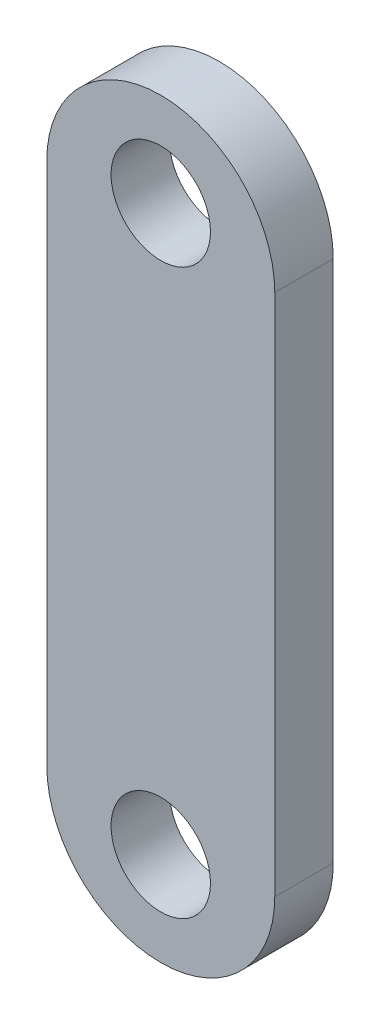
ISO-10303-21;
HEADER;
FILE_DESCRIPTION(('STEP AP214'),'2;1');
FILE_NAME('part.step','',(''),(''),'','','');
FILE_SCHEMA(('AUTOMOTIVE_DESIGN { 1 0 10303 214 1 1 1 1 }'));
ENDSEC;
DATA;
#1=APPLICATION_CONTEXT('core data for automotive mechanical design processes');
#2=APPLICATION_PROTOCOL_DEFINITION('international standard','automotive_design',2000,#1);
#3=PRODUCT_CONTEXT('',#1,'mechanical');
#4=PRODUCT('Part','Part','',(#3));
#5=PRODUCT_RELATED_PRODUCT_CATEGORY('part','',(#4));
#6=PRODUCT_DEFINITION_FORMATION('','',#4);
#7=PRODUCT_DEFINITION_CONTEXT('part definition',#1,'design');
#8=PRODUCT_DEFINITION('design','',#6,#7);
#9=PRODUCT_DEFINITION_SHAPE('','',#8);
#10=(LENGTH_UNIT() NAMED_UNIT(*) SI_UNIT(.MILLI.,.METRE.));
#11=(NAMED_UNIT(*) PLANE_ANGLE_UNIT() SI_UNIT($,.RADIAN.));
#12=(NAMED_UNIT(*) SI_UNIT($,.STERADIAN.) SOLID_ANGLE_UNIT());
#13=UNCERTAINTY_MEASURE_WITH_UNIT(LENGTH_MEASURE(1.E-05),#10,'distance_accuracy_value','');
#14=(GEOMETRIC_REPRESENTATION_CONTEXT(3) GLOBAL_UNCERTAINTY_ASSIGNED_CONTEXT((#13)) GLOBAL_UNIT_ASSIGNED_CONTEXT((#10,
#11,#12)) REPRESENTATION_CONTEXT('',''));
#15=CARTESIAN_POINT('',(0.,0.,0.));
#16=DIRECTION('',(0.,0.,1.));
#17=DIRECTION('',(1.,0.,0.));
#18=AXIS2_PLACEMENT_3D('',#15,#16,#17);
#19=CARTESIAN_POINT('',(0.,9.65,2.));
#20=DIRECTION('',(0.,0.,1.));
#21=DIRECTION('',(1.,0.,0.));
#22=AXIS2_PLACEMENT_3D('',#19,#20,#21);
#23=CYLINDRICAL_SURFACE('',#22,1.7);
#24=CARTESIAN_POINT('',(0.,9.65,2.));
#25=DIRECTION('',(0.,0.,1.));
#26=DIRECTION('',(1.,0.,0.));
#27=AXIS2_PLACEMENT_3D('',#24,#25,#26);
#28=CIRCLE('',#27,1.7);
#29=CARTESIAN_POINT('',(1.7,9.65,2.));
#30=VERTEX_POINT('',#29);
#31=EDGE_CURVE('E11',#30,#30,#28,.T.);
#32=ORIENTED_EDGE('',*,*,#31,.T.);
#33=EDGE_LOOP('',(#32));
#34=FACE_BOUND('',#33,.T.);
#35=CARTESIAN_POINT('',(0.,9.65,0.));
#36=DIRECTION('',(0.,0.,1.));
#37=DIRECTION('',(1.,0.,0.));
#38=AXIS2_PLACEMENT_3D('',#35,#36,#37);
#39=CIRCLE('',#38,1.7);
#40=CARTESIAN_POINT('',(1.7,9.65,0.));
#41=VERTEX_POINT('',#40);
#42=EDGE_CURVE('E79',#41,#41,#39,.T.);
#43=ORIENTED_EDGE('',*,*,#42,.F.);
#44=EDGE_LOOP('',(#43));
#45=FACE_BOUND('',#44,.T.);
#46=ADVANCED_FACE('F16',(#34,#45),#23,.F.);
#47=CARTESIAN_POINT('',(0.,-9.65,2.));
#48=DIRECTION('',(0.,0.,1.));
#49=DIRECTION('',(1.,0.,0.));
#50=AXIS2_PLACEMENT_3D('',#47,#48,#49);
#51=CYLINDRICAL_SURFACE('',#50,1.7);
#52=CARTESIAN_POINT('',(0.,-9.65,2.));
#53=DIRECTION('',(0.,0.,1.));
#54=DIRECTION('',(1.,0.,0.));
#55=AXIS2_PLACEMENT_3D('',#52,#53,#54);
#56=CIRCLE('',#55,1.7);
#57=CARTESIAN_POINT('',(1.7,-9.65,2.));
#58=VERTEX_POINT('',#57);
#59=EDGE_CURVE('E26',#58,#58,#56,.T.);
#60=ORIENTED_EDGE('',*,*,#59,.T.);
#61=EDGE_LOOP('',(#60));
#62=FACE_BOUND('',#61,.T.);
#63=CARTESIAN_POINT('',(0.,-9.65,0.));
#64=DIRECTION('',(0.,0.,1.));
#65=DIRECTION('',(1.,0.,0.));
#66=AXIS2_PLACEMENT_3D('',#63,#64,#65);
#67=CIRCLE('',#66,1.7);
#68=CARTESIAN_POINT('',(1.7,-9.65,0.));
#69=VERTEX_POINT('',#68);
#70=EDGE_CURVE('E81',#69,#69,#67,.T.);
#71=ORIENTED_EDGE('',*,*,#70,.F.);
#72=EDGE_LOOP('',(#71));
#73=FACE_BOUND('',#72,.T.);
#74=ADVANCED_FACE('F114',(#62,#73),#51,.F.);
#75=CARTESIAN_POINT('',(0.,8.95,2.));
#76=DIRECTION('',(0.,0.,-1.));
#77=DIRECTION('',(0.,-1.,0.));
#78=AXIS2_PLACEMENT_3D('',#75,#76,#77);
#79=CYLINDRICAL_SURFACE('',#78,3.9);
#80=CARTESIAN_POINT('',(0.,8.95,0.));
#81=DIRECTION('',(0.,0.,1.));
#82=DIRECTION('',(1.,0.,0.));
#83=AXIS2_PLACEMENT_3D('',#80,#81,#82);
#84=CIRCLE('',#83,3.9);
#85=CARTESIAN_POINT('',(3.9,8.95,0.));
#86=VERTEX_POINT('',#85);
#87=CARTESIAN_POINT('',(-3.9,8.95,0.));
#88=VERTEX_POINT('',#87);
#89=EDGE_CURVE('E89',#86,#88,#84,.T.);
#90=ORIENTED_EDGE('',*,*,#89,.T.);
#91=DIRECTION('',(0.,0.,-1.));
#92=VECTOR('',#91,1.);
#93=CARTESIAN_POINT('',(-3.9,8.95,2.));
#94=LINE('',#93,#92);
#95=CARTESIAN_POINT('',(-3.9,8.95,2.));
#96=VERTEX_POINT('',#95);
#97=EDGE_CURVE('E35',#96,#88,#94,.T.);
#98=ORIENTED_EDGE('',*,*,#97,.F.);
#99=CARTESIAN_POINT('',(0.,8.95,2.));
#100=DIRECTION('',(0.,0.,1.));
#101=DIRECTION('',(1.,0.,0.));
#102=AXIS2_PLACEMENT_3D('',#99,#100,#101);
#103=CIRCLE('',#102,3.9);
#104=CARTESIAN_POINT('',(3.9,8.95,2.));
#105=VERTEX_POINT('',#104);
#106=EDGE_CURVE('E73',#105,#96,#103,.T.);
#107=ORIENTED_EDGE('',*,*,#106,.F.);
#108=DIRECTION('',(0.,0.,-1.));
#109=VECTOR('',#108,1.);
#110=CARTESIAN_POINT('',(3.9,8.95,2.));
#111=LINE('',#110,#109);
#112=EDGE_CURVE('E78',#105,#86,#111,.T.);
#113=ORIENTED_EDGE('',*,*,#112,.T.);
#114=EDGE_LOOP('',(#90,#98,#107,#113));
#115=FACE_BOUND('',#114,.T.);
#116=ADVANCED_FACE('F105',(#115),#79,.T.);
#117=CARTESIAN_POINT('',(-3.9,8.95,2.));
#118=DIRECTION('',(1.,0.,0.));
#119=DIRECTION('',(0.,0.,-1.));
#120=AXIS2_PLACEMENT_3D('',#117,#118,#119);
#121=PLANE('',#120);
#122=DIRECTION('',(0.,-1.,0.));
#123=VECTOR('',#122,1.);
#124=CARTESIAN_POINT('',(-3.9,8.95,0.));
#125=LINE('',#124,#123);
#126=CARTESIAN_POINT('',(-3.9,-8.95,0.));
#127=VERTEX_POINT('',#126);
#128=EDGE_CURVE('E93',#88,#127,#125,.T.);
#129=ORIENTED_EDGE('',*,*,#128,.T.);
#130=DIRECTION('',(0.,0.,-1.));
#131=VECTOR('',#130,1.);
#132=CARTESIAN_POINT('',(-3.9,-8.95,2.));
#133=LINE('',#132,#131);
#134=CARTESIAN_POINT('',(-3.9,-8.95,2.));
#135=VERTEX_POINT('',#134);
#136=EDGE_CURVE('E97',#135,#127,#133,.T.);
#137=ORIENTED_EDGE('',*,*,#136,.F.);
#138=DIRECTION('',(0.,-1.,0.));
#139=VECTOR('',#138,1.);
#140=CARTESIAN_POINT('',(-3.9,8.95,2.));
#141=LINE('',#140,#139);
#142=EDGE_CURVE('E65',#96,#135,#141,.T.);
#143=ORIENTED_EDGE('',*,*,#142,.F.);
#144=ORIENTED_EDGE('',*,*,#97,.T.);
#145=EDGE_LOOP('',(#129,#137,#143,#144));
#146=FACE_BOUND('',#145,.T.);
#147=ADVANCED_FACE('F106',(#146),#121,.F.);
#148=CARTESIAN_POINT('',(0.,-8.95,2.));
#149=DIRECTION('',(0.,0.,-1.));
#150=DIRECTION('',(0.,-1.,0.));
#151=AXIS2_PLACEMENT_3D('',#148,#149,#150);
#152=CYLINDRICAL_SURFACE('',#151,3.9);
#153=CARTESIAN_POINT('',(0.,-8.95,0.));
#154=DIRECTION('',(0.,0.,1.));
#155=DIRECTION('',(1.,0.,0.));
#156=AXIS2_PLACEMENT_3D('',#153,#154,#155);
#157=CIRCLE('',#156,3.9);
#158=CARTESIAN_POINT('',(3.9,-8.95,0.));
#159=VERTEX_POINT('',#158);
#160=EDGE_CURVE('E70',#127,#159,#157,.T.);
#161=ORIENTED_EDGE('',*,*,#160,.T.);
#162=DIRECTION('',(0.,0.,-1.));
#163=VECTOR('',#162,1.);
#164=CARTESIAN_POINT('',(3.9,-8.95,2.));
#165=LINE('',#164,#163);
#166=CARTESIAN_POINT('',(3.9,-8.95,2.));
#167=VERTEX_POINT('',#166);
#168=EDGE_CURVE('E56',#167,#159,#165,.T.);
#169=ORIENTED_EDGE('',*,*,#168,.F.);
#170=CARTESIAN_POINT('',(0.,-8.95,2.));
#171=DIRECTION('',(0.,0.,1.));
#172=DIRECTION('',(1.,0.,0.));
#173=AXIS2_PLACEMENT_3D('',#170,#171,#172);
#174=CIRCLE('',#173,3.9);
#175=EDGE_CURVE('E62',#135,#167,#174,.T.);
#176=ORIENTED_EDGE('',*,*,#175,.F.);
#177=ORIENTED_EDGE('',*,*,#136,.T.);
#178=EDGE_LOOP('',(#161,#169,#176,#177));
#179=FACE_BOUND('',#178,.T.);
#180=ADVANCED_FACE('F18',(#179),#152,.T.);
#181=CARTESIAN_POINT('',(3.9,8.95,2.));
#182=DIRECTION('',(-1.,0.,0.));
#183=DIRECTION('',(0.,0.,1.));
#184=AXIS2_PLACEMENT_3D('',#181,#182,#183);
#185=PLANE('',#184);
#186=DIRECTION('',(0.,1.,0.));
#187=VECTOR('',#186,1.);
#188=CARTESIAN_POINT('',(3.9,8.95,0.));
#189=LINE('',#188,#187);
#190=EDGE_CURVE('E72',#159,#86,#189,.T.);
#191=ORIENTED_EDGE('',*,*,#190,.T.);
#192=ORIENTED_EDGE('',*,*,#112,.F.);
#193=DIRECTION('',(0.,1.,0.));
#194=VECTOR('',#193,1.);
#195=CARTESIAN_POINT('',(3.9,8.95,2.));
#196=LINE('',#195,#194);
#197=EDGE_CURVE('E20',#167,#105,#196,.T.);
#198=ORIENTED_EDGE('',*,*,#197,.F.);
#199=ORIENTED_EDGE('',*,*,#168,.T.);
#200=EDGE_LOOP('',(#191,#192,#198,#199));
#201=FACE_BOUND('',#200,.T.);
#202=ADVANCED_FACE('F76',(#201),#185,.F.);
#203=CARTESIAN_POINT('',(0.,8.95,2.));
#204=DIRECTION('',(0.,0.,1.));
#205=DIRECTION('',(1.,0.,0.));
#206=AXIS2_PLACEMENT_3D('',#203,#204,#205);
#207=PLANE('',#206);
#208=ORIENTED_EDGE('',*,*,#106,.T.);
#209=ORIENTED_EDGE('',*,*,#142,.T.);
#210=ORIENTED_EDGE('',*,*,#175,.T.);
#211=ORIENTED_EDGE('',*,*,#197,.T.);
#212=EDGE_LOOP('',(#208,#209,#210,#211));
#213=FACE_BOUND('',#212,.T.);
#214=ORIENTED_EDGE('',*,*,#31,.F.);
#215=EDGE_LOOP('',(#214));
#216=FACE_BOUND('',#215,.T.);
#217=ORIENTED_EDGE('',*,*,#59,.F.);
#218=EDGE_LOOP('',(#217));
#219=FACE_BOUND('',#218,.T.);
#220=ADVANCED_FACE('F63',(#213,#216,#219),#207,.T.);
#221=CARTESIAN_POINT('',(0.,8.95,0.));
#222=DIRECTION('',(0.,0.,1.));
#223=DIRECTION('',(1.,0.,0.));
#224=AXIS2_PLACEMENT_3D('',#221,#222,#223);
#225=PLANE('',#224);
#226=ORIENTED_EDGE('',*,*,#89,.F.);
#227=ORIENTED_EDGE('',*,*,#190,.F.);
#228=ORIENTED_EDGE('',*,*,#160,.F.);
#229=ORIENTED_EDGE('',*,*,#128,.F.);
#230=EDGE_LOOP('',(#226,#227,#228,#229));
#231=FACE_BOUND('',#230,.T.);
#232=ORIENTED_EDGE('',*,*,#42,.T.);
#233=EDGE_LOOP('',(#232));
#234=FACE_BOUND('',#233,.T.);
#235=ORIENTED_EDGE('',*,*,#70,.T.);
#236=EDGE_LOOP('',(#235));
#237=FACE_BOUND('',#236,.T.);
#238=ADVANCED_FACE('F102',(#231,#234,#237),#225,.F.);
#239=CLOSED_SHELL('',(#46,#74,#116,#147,#180,#202,#220,#238));
#240=MANIFOLD_SOLID_BREP('B1',#239);
#241=ADVANCED_BREP_SHAPE_REPRESENTATION('',(#18,#240),#14);
#242=SHAPE_DEFINITION_REPRESENTATION(#9,#241);
ENDSEC;
END-ISO-10303-21;
